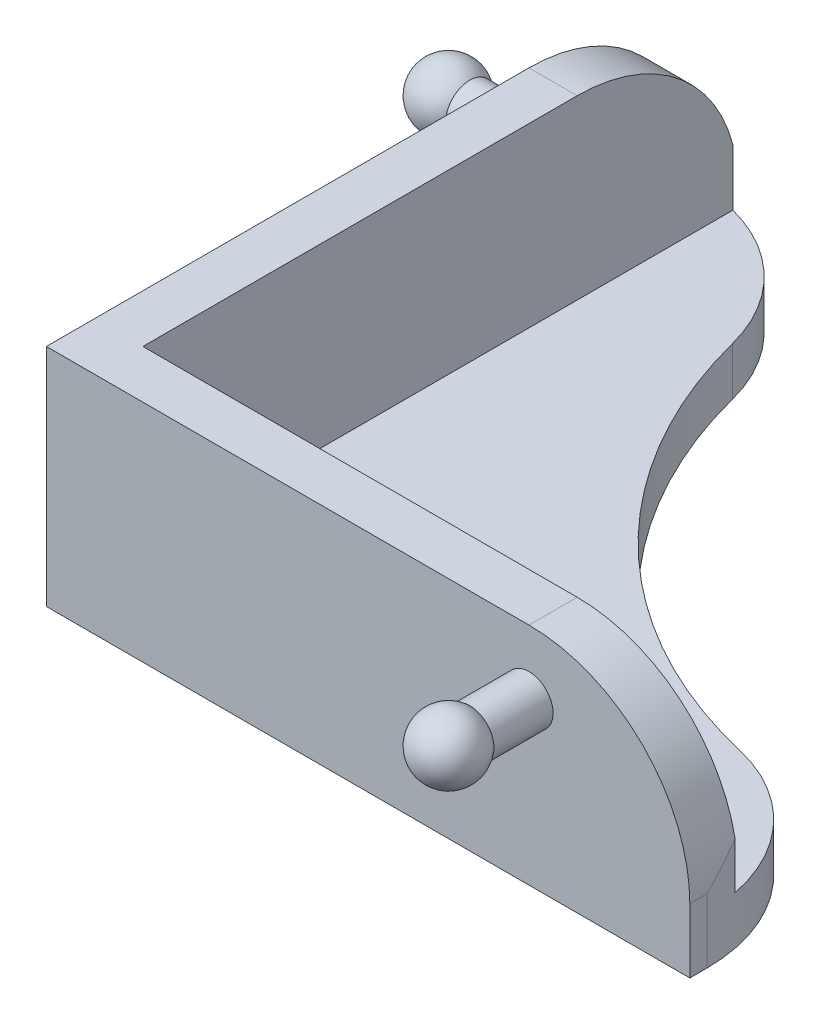
ISO-10303-21;
HEADER;
FILE_DESCRIPTION(('STEP AP214'),'2;1');
FILE_NAME('part.step','',(''),(''),'','','');
FILE_SCHEMA(('AUTOMOTIVE_DESIGN { 1 0 10303 214 1 1 1 1 }'));
ENDSEC;
DATA;
#1=APPLICATION_CONTEXT('core data for automotive mechanical design processes');
#2=APPLICATION_PROTOCOL_DEFINITION('international standard','automotive_design',2000,#1);
#3=PRODUCT_CONTEXT('',#1,'mechanical');
#4=PRODUCT('Part','Part','',(#3));
#5=PRODUCT_RELATED_PRODUCT_CATEGORY('part','',(#4));
#6=PRODUCT_DEFINITION_FORMATION('','',#4);
#7=PRODUCT_DEFINITION_CONTEXT('part definition',#1,'design');
#8=PRODUCT_DEFINITION('design','',#6,#7);
#9=PRODUCT_DEFINITION_SHAPE('','',#8);
#10=(LENGTH_UNIT() NAMED_UNIT(*) SI_UNIT(.MILLI.,.METRE.));
#11=(NAMED_UNIT(*) PLANE_ANGLE_UNIT() SI_UNIT($,.RADIAN.));
#12=(NAMED_UNIT(*) SI_UNIT($,.STERADIAN.) SOLID_ANGLE_UNIT());
#13=UNCERTAINTY_MEASURE_WITH_UNIT(LENGTH_MEASURE(1.E-05),#10,'distance_accuracy_value','');
#14=(GEOMETRIC_REPRESENTATION_CONTEXT(3) GLOBAL_UNCERTAINTY_ASSIGNED_CONTEXT((#13)) GLOBAL_UNIT_ASSIGNED_CONTEXT((#10,
#11,#12)) REPRESENTATION_CONTEXT('',''));
#15=CARTESIAN_POINT('',(0.,0.,0.));
#16=DIRECTION('',(0.,0.,1.));
#17=DIRECTION('',(1.,0.,0.));
#18=AXIS2_PLACEMENT_3D('',#15,#16,#17);
#19=CARTESIAN_POINT('',(0.,3.,0.));
#20=DIRECTION('',(0.,1.,0.));
#21=DIRECTION('',(0.,0.,1.));
#22=AXIS2_PLACEMENT_3D('',#19,#20,#21);
#23=PLANE('',#22);
#24=CARTESIAN_POINT('',(-16.3316434168253,3.,-19.5022624434389));
#25=DIRECTION('',(0.,1.,0.));
#26=DIRECTION('',(0.,0.,1.));
#27=AXIS2_PLACEMENT_3D('',#24,#25,#26);
#28=CIRCLE('',#27,10.);
#29=CARTESIAN_POINT('',(-6.64918505130675,3.,-22.0022624434389));
#30=VERTEX_POINT('',#29);
#31=CARTESIAN_POINT('',(-13.8131021136712,3.,-29.1799145194492));
#32=VERTEX_POINT('',#31);
#33=EDGE_CURVE('E228',#30,#32,#28,.T.);
#34=ORIENTED_EDGE('',*,*,#33,.T.);
#35=DIRECTION('',(0.,0.,1.));
#36=VECTOR('',#35,1.);
#37=CARTESIAN_POINT('',(-13.8131021136712,3.,0.));
#38=LINE('',#37,#36);
#39=CARTESIAN_POINT('',(-13.8131021136712,3.,7.49773755656109));
#40=VERTEX_POINT('',#39);
#41=EDGE_CURVE('E284',#32,#40,#38,.T.);
#42=ORIENTED_EDGE('',*,*,#41,.T.);
#43=DIRECTION('',(-1.,0.,0.));
#44=VECTOR('',#43,1.);
#45=CARTESIAN_POINT('',(0.,3.,7.49773755656109));
#46=LINE('',#45,#44);
#47=CARTESIAN_POINT('',(22.9998765107708,3.,7.49773755656109));
#48=VERTEX_POINT('',#47);
#49=EDGE_CURVE('E279',#48,#40,#46,.T.);
#50=ORIENTED_EDGE('',*,*,#49,.F.);
#51=CARTESIAN_POINT('',(13.1868978863288,3.,9.42269223557153));
#52=DIRECTION('',(0.,1.,0.));
#53=DIRECTION('',(0.,0.,1.));
#54=AXIS2_PLACEMENT_3D('',#51,#52,#53);
#55=CIRCLE('',#54,10.);
#56=CARTESIAN_POINT('',(15.4897209260588,3.,-0.30854643418108));
#57=VERTEX_POINT('',#56);
#58=EDGE_CURVE('E226',#57,#48,#55,.F.);
#59=ORIENTED_EDGE('',*,*,#58,.F.);
#60=CARTESIAN_POINT('',(22.3981900452489,3.,-29.5022624434389));
#61=DIRECTION('',(0.,1.,0.));
#62=DIRECTION('',(0.,0.,1.));
#63=AXIS2_PLACEMENT_3D('',#60,#61,#62);
#64=CIRCLE('',#63,30.);
#65=EDGE_CURVE('E232',#30,#57,#64,.T.);
#66=ORIENTED_EDGE('',*,*,#65,.F.);
#67=EDGE_LOOP('',(#34,#42,#50,#59,#66));
#68=FACE_BOUND('',#67,.T.);
#69=ADVANCED_FACE('F87',(#68),#23,.T.);
#70=CARTESIAN_POINT('',(22.3981900452489,3.,-29.5022624434389));
#71=DIRECTION('',(0.,-1.,0.));
#72=DIRECTION('',(0.,0.,-1.));
#73=AXIS2_PLACEMENT_3D('',#70,#71,#72);
#74=CYLINDRICAL_SURFACE('',#73,30.);
#75=CARTESIAN_POINT('',(22.3981900452489,0.,-29.5022624434389));
#76=DIRECTION('',(0.,1.,0.));
#77=DIRECTION('',(0.,0.,1.));
#78=AXIS2_PLACEMENT_3D('',#75,#76,#77);
#79=CIRCLE('',#78,30.);
#80=CARTESIAN_POINT('',(-6.64918505130675,0.,-22.0022624434389));
#81=VERTEX_POINT('',#80);
#82=CARTESIAN_POINT('',(15.4897209260588,0.,-0.30854643418108));
#83=VERTEX_POINT('',#82);
#84=EDGE_CURVE('E233',#81,#83,#79,.T.);
#85=ORIENTED_EDGE('',*,*,#84,.F.);
#86=DIRECTION('',(0.,-1.,0.));
#87=VECTOR('',#86,1.);
#88=CARTESIAN_POINT('',(-6.64918505130675,3.,-22.0022624434389));
#89=LINE('',#88,#87);
#90=EDGE_CURVE('E239',#30,#81,#89,.T.);
#91=ORIENTED_EDGE('',*,*,#90,.F.);
#92=ORIENTED_EDGE('',*,*,#65,.T.);
#93=DIRECTION('',(0.,-1.,0.));
#94=VECTOR('',#93,1.);
#95=CARTESIAN_POINT('',(15.4897209260588,3.,-0.30854643418108));
#96=LINE('',#95,#94);
#97=EDGE_CURVE('E264',#57,#83,#96,.T.);
#98=ORIENTED_EDGE('',*,*,#97,.T.);
#99=EDGE_LOOP('',(#85,#91,#92,#98));
#100=FACE_BOUND('',#99,.T.);
#101=ADVANCED_FACE('F331',(#100),#74,.F.);
#102=CARTESIAN_POINT('',(0.,0.,0.));
#103=DIRECTION('',(0.,1.,0.));
#104=DIRECTION('',(0.,0.,1.));
#105=AXIS2_PLACEMENT_3D('',#102,#103,#104);
#106=PLANE('',#105);
#107=DIRECTION('',(1.,0.,0.));
#108=VECTOR('',#107,1.);
#109=CARTESIAN_POINT('',(0.,0.,-29.5022624434389));
#110=LINE('',#109,#108);
#111=CARTESIAN_POINT('',(-16.8131021136712,0.,-29.5022624434389));
#112=VERTEX_POINT('',#111);
#113=CARTESIAN_POINT('',(-16.3316434168253,0.,-29.5022624434389));
#114=VERTEX_POINT('',#113);
#115=EDGE_CURVE('E242',#112,#114,#110,.T.);
#116=ORIENTED_EDGE('',*,*,#115,.T.);
#117=CARTESIAN_POINT('',(-16.3316434168253,0.,-19.5022624434389));
#118=DIRECTION('',(0.,1.,0.));
#119=DIRECTION('',(0.,0.,1.));
#120=AXIS2_PLACEMENT_3D('',#117,#118,#119);
#121=CIRCLE('',#120,10.);
#122=EDGE_CURVE('E223',#81,#114,#121,.T.);
#123=ORIENTED_EDGE('',*,*,#122,.F.);
#124=ORIENTED_EDGE('',*,*,#84,.T.);
#125=CARTESIAN_POINT('',(13.1868978863288,0.,9.42269223557153));
#126=DIRECTION('',(0.,1.,0.));
#127=DIRECTION('',(0.,0.,1.));
#128=AXIS2_PLACEMENT_3D('',#125,#126,#127);
#129=CIRCLE('',#128,10.);
#130=CARTESIAN_POINT('',(23.1868978863288,0.,9.42269223557153));
#131=VERTEX_POINT('',#130);
#132=EDGE_CURVE('E258',#83,#131,#129,.F.);
#133=ORIENTED_EDGE('',*,*,#132,.T.);
#134=DIRECTION('',(0.,0.,1.));
#135=VECTOR('',#134,1.);
#136=CARTESIAN_POINT('',(23.1868978863287,0.,0.));
#137=LINE('',#136,#135);
#138=CARTESIAN_POINT('',(23.1868978863288,0.,10.4977375565611));
#139=VERTEX_POINT('',#138);
#140=EDGE_CURVE('E252',#131,#139,#137,.T.);
#141=ORIENTED_EDGE('',*,*,#140,.T.);
#142=DIRECTION('',(1.,0.,0.));
#143=VECTOR('',#142,1.);
#144=CARTESIAN_POINT('',(0.,0.,10.4977375565611));
#145=LINE('',#144,#143);
#146=CARTESIAN_POINT('',(-16.8131021136712,0.,10.4977375565611));
#147=VERTEX_POINT('',#146);
#148=EDGE_CURVE('E249',#147,#139,#145,.T.);
#149=ORIENTED_EDGE('',*,*,#148,.F.);
#150=DIRECTION('',(0.,0.,1.));
#151=VECTOR('',#150,1.);
#152=CARTESIAN_POINT('',(-16.8131021136712,0.,0.));
#153=LINE('',#152,#151);
#154=EDGE_CURVE('E196',#112,#147,#153,.T.);
#155=ORIENTED_EDGE('',*,*,#154,.F.);
#156=EDGE_LOOP('',(#116,#123,#124,#133,#141,#149,#155));
#157=FACE_BOUND('',#156,.T.);
#158=ADVANCED_FACE('F339',(#157),#106,.F.);
#159=CARTESIAN_POINT('',(13.1868978863288,3.,9.42269223557153));
#160=DIRECTION('',(0.,-1.,0.));
#161=DIRECTION('',(0.,0.,-1.));
#162=AXIS2_PLACEMENT_3D('',#159,#160,#161);
#163=CYLINDRICAL_SURFACE('',#162,10.);
#164=DIRECTION('',(0.,-1.,0.));
#165=VECTOR('',#164,1.);
#166=CARTESIAN_POINT('',(22.9998765107708,14.,7.49773755656109));
#167=LINE('',#166,#165);
#168=CARTESIAN_POINT('',(22.9998765107708,5.92495467901039,7.49773755656109));
#169=VERTEX_POINT('',#168);
#170=EDGE_CURVE('E218',#169,#48,#167,.T.);
#171=ORIENTED_EDGE('',*,*,#170,.F.);
#172=CARTESIAN_POINT('',(13.1868978863288,4.,9.42269223557153));
#173=DIRECTION('',(0.,-0.707106781186547,-0.707106781186547));
#174=DIRECTION('',(0.,-0.707106781186547,0.707106781186547));
#175=AXIS2_PLACEMENT_3D('',#172,#173,#174);
#176=ELLIPSE('',#175,14.142135623731,10.);
#177=CARTESIAN_POINT('',(23.1868978863288,4.,9.42269223557153));
#178=VERTEX_POINT('',#177);
#179=EDGE_CURVE('E309',#169,#178,#176,.T.);
#180=ORIENTED_EDGE('',*,*,#179,.T.);
#181=DIRECTION('',(0.,-1.,0.));
#182=VECTOR('',#181,1.);
#183=CARTESIAN_POINT('',(23.1868978863288,3.,9.42269223557153));
#184=LINE('',#183,#182);
#185=EDGE_CURVE('E268',#178,#131,#184,.T.);
#186=ORIENTED_EDGE('',*,*,#185,.T.);
#187=ORIENTED_EDGE('',*,*,#132,.F.);
#188=ORIENTED_EDGE('',*,*,#97,.F.);
#189=ORIENTED_EDGE('',*,*,#58,.T.);
#190=EDGE_LOOP('',(#171,#180,#186,#187,#188,#189));
#191=FACE_BOUND('',#190,.T.);
#192=ADVANCED_FACE('F344',(#191),#163,.T.);
#193=CARTESIAN_POINT('',(23.1868978863287,3.,0.));
#194=DIRECTION('',(1.,0.,0.));
#195=DIRECTION('',(0.,0.,-1.));
#196=AXIS2_PLACEMENT_3D('',#193,#194,#195);
#197=PLANE('',#196);
#198=ORIENTED_EDGE('',*,*,#185,.F.);
#199=DIRECTION('',(0.,0.,1.));
#200=VECTOR('',#199,1.);
#201=CARTESIAN_POINT('',(23.1868978863287,4.,0.));
#202=LINE('',#201,#200);
#203=CARTESIAN_POINT('',(23.1868978863288,4.,10.4977375565611));
#204=VERTEX_POINT('',#203);
#205=EDGE_CURVE('E301',#178,#204,#202,.T.);
#206=ORIENTED_EDGE('',*,*,#205,.T.);
#207=DIRECTION('',(0.,-1.,0.));
#208=VECTOR('',#207,1.);
#209=CARTESIAN_POINT('',(23.1868978863288,3.,10.4977375565611));
#210=LINE('',#209,#208);
#211=EDGE_CURVE('E204',#204,#139,#210,.T.);
#212=ORIENTED_EDGE('',*,*,#211,.T.);
#213=ORIENTED_EDGE('',*,*,#140,.F.);
#214=EDGE_LOOP('',(#198,#206,#212,#213));
#215=FACE_BOUND('',#214,.T.);
#216=ADVANCED_FACE('F353',(#215),#197,.T.);
#217=CARTESIAN_POINT('',(0.,3.,10.4977375565611));
#218=DIRECTION('',(0.,0.,-1.));
#219=DIRECTION('',(-1.,0.,0.));
#220=AXIS2_PLACEMENT_3D('',#217,#218,#219);
#221=PLANE('',#220);
#222=CARTESIAN_POINT('',(13.1868978863288,10.,10.4977375565611));
#223=DIRECTION('',(0.,0.,1.));
#224=DIRECTION('',(1.,0.,0.));
#225=AXIS2_PLACEMENT_3D('',#222,#223,#224);
#226=CIRCLE('',#225,1.5);
#227=CARTESIAN_POINT('',(14.6868978863288,10.,10.4977375565611));
#228=VERTEX_POINT('',#227);
#229=EDGE_CURVE('E12',#228,#228,#226,.T.);
#230=ORIENTED_EDGE('',*,*,#229,.F.);
#231=EDGE_LOOP('',(#230));
#232=FACE_BOUND('',#231,.T.);
#233=ORIENTED_EDGE('',*,*,#211,.F.);
#234=CARTESIAN_POINT('',(13.1868978863288,4.,10.4977375565611));
#235=DIRECTION('',(0.,0.,-1.));
#236=DIRECTION('',(-1.,0.,0.));
#237=AXIS2_PLACEMENT_3D('',#234,#235,#236);
#238=CIRCLE('',#237,10.);
#239=CARTESIAN_POINT('',(13.1868978863288,14.,10.4977375565611));
#240=VERTEX_POINT('',#239);
#241=EDGE_CURVE('E114',#204,#240,#238,.F.);
#242=ORIENTED_EDGE('',*,*,#241,.T.);
#243=DIRECTION('',(1.,0.,0.));
#244=VECTOR('',#243,1.);
#245=CARTESIAN_POINT('',(0.,14.,10.4977375565611));
#246=LINE('',#245,#244);
#247=CARTESIAN_POINT('',(-16.8131021136712,14.,10.4977375565611));
#248=VERTEX_POINT('',#247);
#249=EDGE_CURVE('E188',#248,#240,#246,.T.);
#250=ORIENTED_EDGE('',*,*,#249,.F.);
#251=DIRECTION('',(0.,-1.,0.));
#252=VECTOR('',#251,1.);
#253=CARTESIAN_POINT('',(-16.8131021136712,3.,10.4977375565611));
#254=LINE('',#253,#252);
#255=EDGE_CURVE('E192',#248,#147,#254,.T.);
#256=ORIENTED_EDGE('',*,*,#255,.T.);
#257=ORIENTED_EDGE('',*,*,#148,.T.);
#258=EDGE_LOOP('',(#233,#242,#250,#256,#257));
#259=FACE_BOUND('',#258,.T.);
#260=ADVANCED_FACE('F210',(#232,#259),#221,.F.);
#261=CARTESIAN_POINT('',(-16.8131021136712,3.,0.));
#262=DIRECTION('',(1.,0.,0.));
#263=DIRECTION('',(0.,0.,-1.));
#264=AXIS2_PLACEMENT_3D('',#261,#262,#263);
#265=PLANE('',#264);
#266=CARTESIAN_POINT('',(-16.8131021136712,10.,-19.5022624434389));
#267=DIRECTION('',(-1.,0.,0.));
#268=DIRECTION('',(0.,0.,1.));
#269=AXIS2_PLACEMENT_3D('',#266,#267,#268);
#270=CIRCLE('',#269,1.5);
#271=CARTESIAN_POINT('',(-16.8131021136712,10.,-18.0022624434389));
#272=VERTEX_POINT('',#271);
#273=EDGE_CURVE('E100',#272,#272,#270,.T.);
#274=ORIENTED_EDGE('',*,*,#273,.F.);
#275=EDGE_LOOP('',(#274));
#276=FACE_BOUND('',#275,.T.);
#277=DIRECTION('',(0.,0.,1.));
#278=VECTOR('',#277,1.);
#279=CARTESIAN_POINT('',(-16.8131021136712,14.,0.));
#280=LINE('',#279,#278);
#281=CARTESIAN_POINT('',(-16.8131021136712,14.,-19.5022624434389));
#282=VERTEX_POINT('',#281);
#283=EDGE_CURVE('E182',#282,#248,#280,.T.);
#284=ORIENTED_EDGE('',*,*,#283,.F.);
#285=CARTESIAN_POINT('',(-16.8131021136712,4.,-19.5022624434389));
#286=DIRECTION('',(1.,0.,0.));
#287=DIRECTION('',(0.,0.,-1.));
#288=AXIS2_PLACEMENT_3D('',#285,#286,#287);
#289=CIRCLE('',#288,10.);
#290=CARTESIAN_POINT('',(-16.8131021136712,4.,-29.5022624434389));
#291=VERTEX_POINT('',#290);
#292=EDGE_CURVE('E296',#282,#291,#289,.F.);
#293=ORIENTED_EDGE('',*,*,#292,.T.);
#294=DIRECTION('',(0.,-1.,0.));
#295=VECTOR('',#294,1.);
#296=CARTESIAN_POINT('',(-16.8131021136712,3.,-29.5022624434389));
#297=LINE('',#296,#295);
#298=EDGE_CURVE('E201',#291,#112,#297,.T.);
#299=ORIENTED_EDGE('',*,*,#298,.T.);
#300=ORIENTED_EDGE('',*,*,#154,.T.);
#301=ORIENTED_EDGE('',*,*,#255,.F.);
#302=EDGE_LOOP('',(#284,#293,#299,#300,#301));
#303=FACE_BOUND('',#302,.T.);
#304=ADVANCED_FACE('F198',(#276,#303),#265,.F.);
#305=CARTESIAN_POINT('',(0.,3.,-29.5022624434389));
#306=DIRECTION('',(0.,0.,-1.));
#307=DIRECTION('',(-1.,0.,0.));
#308=AXIS2_PLACEMENT_3D('',#305,#306,#307);
#309=PLANE('',#308);
#310=ORIENTED_EDGE('',*,*,#298,.F.);
#311=DIRECTION('',(1.,0.,0.));
#312=VECTOR('',#311,1.);
#313=CARTESIAN_POINT('',(0.,4.,-29.5022624434389));
#314=LINE('',#313,#312);
#315=CARTESIAN_POINT('',(-16.3316434168253,4.,-29.5022624434389));
#316=VERTEX_POINT('',#315);
#317=EDGE_CURVE('E281',#291,#316,#314,.T.);
#318=ORIENTED_EDGE('',*,*,#317,.T.);
#319=DIRECTION('',(0.,-1.,0.));
#320=VECTOR('',#319,1.);
#321=CARTESIAN_POINT('',(-16.3316434168253,3.,-29.5022624434389));
#322=LINE('',#321,#320);
#323=EDGE_CURVE('E274',#316,#114,#322,.T.);
#324=ORIENTED_EDGE('',*,*,#323,.T.);
#325=ORIENTED_EDGE('',*,*,#115,.F.);
#326=EDGE_LOOP('',(#310,#318,#324,#325));
#327=FACE_BOUND('',#326,.T.);
#328=ADVANCED_FACE('F361',(#327),#309,.T.);
#329=CARTESIAN_POINT('',(-16.3316434168253,3.,-19.5022624434389));
#330=DIRECTION('',(0.,-1.,0.));
#331=DIRECTION('',(0.,0.,-1.));
#332=AXIS2_PLACEMENT_3D('',#329,#330,#331);
#333=CYLINDRICAL_SURFACE('',#332,10.);
#334=ORIENTED_EDGE('',*,*,#323,.F.);
#335=CARTESIAN_POINT('',(-16.3316434168253,4.,-19.5022624434389));
#336=DIRECTION('',(0.707106781186547,-0.707106781186547,0.));
#337=DIRECTION('',(0.707106781186547,0.707106781186547,0.));
#338=AXIS2_PLACEMENT_3D('',#335,#336,#337);
#339=ELLIPSE('',#338,14.142135623731,10.);
#340=CARTESIAN_POINT('',(-13.8131021136712,6.51854130315405,-29.1799145194492));
#341=VERTEX_POINT('',#340);
#342=EDGE_CURVE('E289',#316,#341,#339,.T.);
#343=ORIENTED_EDGE('',*,*,#342,.T.);
#344=DIRECTION('',(0.,-1.,0.));
#345=VECTOR('',#344,1.);
#346=CARTESIAN_POINT('',(-13.8131021136712,14.,-29.1799145194492));
#347=LINE('',#346,#345);
#348=EDGE_CURVE('E225',#341,#32,#347,.T.);
#349=ORIENTED_EDGE('',*,*,#348,.T.);
#350=ORIENTED_EDGE('',*,*,#33,.F.);
#351=ORIENTED_EDGE('',*,*,#90,.T.);
#352=ORIENTED_EDGE('',*,*,#122,.T.);
#353=EDGE_LOOP('',(#334,#343,#349,#350,#351,#352));
#354=FACE_BOUND('',#353,.T.);
#355=ADVANCED_FACE('F370',(#354),#333,.T.);
#356=CARTESIAN_POINT('',(-13.8131021136712,14.,0.));
#357=DIRECTION('',(-1.,0.,0.));
#358=DIRECTION('',(0.,0.,1.));
#359=AXIS2_PLACEMENT_3D('',#356,#357,#358);
#360=PLANE('',#359);
#361=ORIENTED_EDGE('',*,*,#348,.F.);
#362=CARTESIAN_POINT('',(-13.8131021136712,4.,-19.5022624434389));
#363=DIRECTION('',(-1.,0.,0.));
#364=DIRECTION('',(0.,0.,1.));
#365=AXIS2_PLACEMENT_3D('',#362,#363,#364);
#366=CIRCLE('',#365,10.);
#367=CARTESIAN_POINT('',(-13.8131021136712,14.,-19.5022624434389));
#368=VERTEX_POINT('',#367);
#369=EDGE_CURVE('E295',#341,#368,#366,.F.);
#370=ORIENTED_EDGE('',*,*,#369,.T.);
#371=DIRECTION('',(0.,0.,-1.));
#372=VECTOR('',#371,1.);
#373=CARTESIAN_POINT('',(-13.8131021136712,14.,0.));
#374=LINE('',#373,#372);
#375=CARTESIAN_POINT('',(-13.8131021136712,14.,7.49773755656109));
#376=VERTEX_POINT('',#375);
#377=EDGE_CURVE('E195',#376,#368,#374,.T.);
#378=ORIENTED_EDGE('',*,*,#377,.F.);
#379=DIRECTION('',(0.,-1.,0.));
#380=VECTOR('',#379,1.);
#381=CARTESIAN_POINT('',(-13.8131021136712,14.,7.49773755656109));
#382=LINE('',#381,#380);
#383=EDGE_CURVE('E215',#376,#40,#382,.T.);
#384=ORIENTED_EDGE('',*,*,#383,.T.);
#385=ORIENTED_EDGE('',*,*,#41,.F.);
#386=EDGE_LOOP('',(#361,#370,#378,#384,#385));
#387=FACE_BOUND('',#386,.T.);
#388=ADVANCED_FACE('F367',(#387),#360,.F.);
#389=CARTESIAN_POINT('',(0.,14.,7.49773755656109));
#390=DIRECTION('',(0.,0.,-1.));
#391=DIRECTION('',(-1.,0.,0.));
#392=AXIS2_PLACEMENT_3D('',#389,#390,#391);
#393=PLANE('',#392);
#394=DIRECTION('',(1.,0.,0.));
#395=VECTOR('',#394,1.);
#396=CARTESIAN_POINT('',(0.,14.,7.49773755656109));
#397=LINE('',#396,#395);
#398=CARTESIAN_POINT('',(13.1868978863288,14.,7.49773755656109));
#399=VERTEX_POINT('',#398);
#400=EDGE_CURVE('E207',#376,#399,#397,.T.);
#401=ORIENTED_EDGE('',*,*,#400,.T.);
#402=CARTESIAN_POINT('',(13.1868978863288,4.,7.49773755656109));
#403=DIRECTION('',(0.,0.,-1.));
#404=DIRECTION('',(-1.,0.,0.));
#405=AXIS2_PLACEMENT_3D('',#402,#403,#404);
#406=CIRCLE('',#405,10.);
#407=EDGE_CURVE('E104',#399,#169,#406,.T.);
#408=ORIENTED_EDGE('',*,*,#407,.T.);
#409=ORIENTED_EDGE('',*,*,#170,.T.);
#410=ORIENTED_EDGE('',*,*,#49,.T.);
#411=ORIENTED_EDGE('',*,*,#383,.F.);
#412=EDGE_LOOP('',(#401,#408,#409,#410,#411));
#413=FACE_BOUND('',#412,.T.);
#414=ADVANCED_FACE('F379',(#413),#393,.T.);
#415=CARTESIAN_POINT('',(0.,14.,0.));
#416=DIRECTION('',(0.,1.,0.));
#417=DIRECTION('',(0.,0.,1.));
#418=AXIS2_PLACEMENT_3D('',#415,#416,#417);
#419=PLANE('',#418);
#420=ORIENTED_EDGE('',*,*,#377,.T.);
#421=DIRECTION('',(1.,0.,0.));
#422=VECTOR('',#421,1.);
#423=CARTESIAN_POINT('',(0.,14.,-19.5022624434389));
#424=LINE('',#423,#422);
#425=EDGE_CURVE('E187',#368,#282,#424,.F.);
#426=ORIENTED_EDGE('',*,*,#425,.T.);
#427=ORIENTED_EDGE('',*,*,#283,.T.);
#428=ORIENTED_EDGE('',*,*,#249,.T.);
#429=DIRECTION('',(0.,0.,1.));
#430=VECTOR('',#429,1.);
#431=CARTESIAN_POINT('',(13.1868978863287,14.,0.));
#432=LINE('',#431,#430);
#433=EDGE_CURVE('E293',#240,#399,#432,.F.);
#434=ORIENTED_EDGE('',*,*,#433,.T.);
#435=ORIENTED_EDGE('',*,*,#400,.F.);
#436=EDGE_LOOP('',(#420,#426,#427,#428,#434,#435));
#437=FACE_BOUND('',#436,.T.);
#438=ADVANCED_FACE('F184',(#437),#419,.T.);
#439=CARTESIAN_POINT('',(0.,4.,-19.5022624434389));
#440=DIRECTION('',(1.,0.,0.));
#441=DIRECTION('',(0.,0.,-1.));
#442=AXIS2_PLACEMENT_3D('',#439,#440,#441);
#443=CYLINDRICAL_SURFACE('',#442,10.);
#444=ORIENTED_EDGE('',*,*,#292,.F.);
#445=ORIENTED_EDGE('',*,*,#425,.F.);
#446=ORIENTED_EDGE('',*,*,#369,.F.);
#447=ORIENTED_EDGE('',*,*,#342,.F.);
#448=ORIENTED_EDGE('',*,*,#317,.F.);
#449=EDGE_LOOP('',(#444,#445,#446,#447,#448));
#450=FACE_BOUND('',#449,.T.);
#451=ADVANCED_FACE('F375',(#450),#443,.T.);
#452=CARTESIAN_POINT('',(13.1868978863287,4.,0.));
#453=DIRECTION('',(0.,0.,1.));
#454=DIRECTION('',(1.,0.,0.));
#455=AXIS2_PLACEMENT_3D('',#452,#453,#454);
#456=CYLINDRICAL_SURFACE('',#455,10.);
#457=ORIENTED_EDGE('',*,*,#407,.F.);
#458=ORIENTED_EDGE('',*,*,#433,.F.);
#459=ORIENTED_EDGE('',*,*,#241,.F.);
#460=ORIENTED_EDGE('',*,*,#205,.F.);
#461=ORIENTED_EDGE('',*,*,#179,.F.);
#462=EDGE_LOOP('',(#457,#458,#459,#460,#461));
#463=FACE_BOUND('',#462,.T.);
#464=ADVANCED_FACE('F90',(#463),#456,.T.);
#465=CARTESIAN_POINT('',(-21.8131021136712,10.,-19.5022624434389));
#466=DIRECTION('',(1.,0.,0.));
#467=DIRECTION('',(0.,0.,-1.));
#468=AXIS2_PLACEMENT_3D('',#465,#466,#467);
#469=CYLINDRICAL_SURFACE('',#468,1.5);
#470=CARTESIAN_POINT('',(-20.4902264581389,10.,-19.5022624434389));
#471=DIRECTION('',(-0.999999999999999,0.,0.));
#472=DIRECTION('',(0.,0.,1.));
#473=AXIS2_PLACEMENT_3D('',#470,#471,#472);
#474=CIRCLE('',#473,1.5);
#475=CARTESIAN_POINT('',(-20.4902264581389,10.,-18.0022624434389));
#476=VERTEX_POINT('',#475);
#477=EDGE_CURVE('E315',#476,#476,#474,.F.);
#478=ORIENTED_EDGE('',*,*,#477,.T.);
#479=EDGE_LOOP('',(#478));
#480=FACE_BOUND('',#479,.T.);
#481=ORIENTED_EDGE('',*,*,#273,.T.);
#482=EDGE_LOOP('',(#481));
#483=FACE_BOUND('',#482,.T.);
#484=ADVANCED_FACE('F377',(#480,#483),#469,.T.);
#485=CARTESIAN_POINT('',(-21.8131021136712,10.,-19.5022624434389));
#486=DIRECTION('',(0.,1.,0.));
#487=DIRECTION('',(0.,0.,1.));
#488=AXIS2_PLACEMENT_3D('',#485,#486,#487);
#489=SPHERICAL_SURFACE('',#488,2.);
#490=CARTESIAN_POINT('',(-21.8131021136712,10.,-19.5022624434389));
#491=DIRECTION('',(-1.,0.,0.));
#492=DIRECTION('',(0.,0.,1.));
#493=AXIS2_PLACEMENT_3D('',#490,#491,#492);
#494=SPHERICAL_SURFACE('',#493,2.);
#495=ORIENTED_EDGE('',*,*,#477,.F.);
#496=EDGE_LOOP('',(#495));
#497=FACE_BOUND('',#496,.T.);
#498=ADVANCED_FACE('F332',(#497),#494,.T.);
#499=CARTESIAN_POINT('',(13.1868978863288,10.,15.4977375565611));
#500=DIRECTION('',(0.,0.,-1.));
#501=DIRECTION('',(-1.,0.,0.));
#502=AXIS2_PLACEMENT_3D('',#499,#500,#501);
#503=CYLINDRICAL_SURFACE('',#502,1.5);
#504=CARTESIAN_POINT('',(13.1868978863288,10.,14.1748619010288));
#505=DIRECTION('',(0.,0.,1.));
#506=DIRECTION('',(1.,0.,0.));
#507=AXIS2_PLACEMENT_3D('',#504,#505,#506);
#508=CIRCLE('',#507,1.5);
#509=CARTESIAN_POINT('',(14.6868978863288,10.,14.1748619010288));
#510=VERTEX_POINT('',#509);
#511=EDGE_CURVE('E93',#510,#510,#508,.F.);
#512=ORIENTED_EDGE('',*,*,#511,.T.);
#513=EDGE_LOOP('',(#512));
#514=FACE_BOUND('',#513,.T.);
#515=ORIENTED_EDGE('',*,*,#229,.T.);
#516=EDGE_LOOP('',(#515));
#517=FACE_BOUND('',#516,.T.);
#518=ADVANCED_FACE('F325',(#514,#517),#503,.T.);
#519=CARTESIAN_POINT('',(13.1868978863288,10.,15.4977375565611));
#520=DIRECTION('',(0.,1.,0.));
#521=DIRECTION('',(1.,0.,0.));
#522=AXIS2_PLACEMENT_3D('',#519,#520,#521);
#523=SPHERICAL_SURFACE('',#522,2.);
#524=CARTESIAN_POINT('',(13.1868978863288,10.,15.4977375565611));
#525=DIRECTION('',(0.,0.,1.));
#526=DIRECTION('',(1.,0.,0.));
#527=AXIS2_PLACEMENT_3D('',#524,#525,#526);
#528=SPHERICAL_SURFACE('',#527,2.);
#529=ORIENTED_EDGE('',*,*,#511,.F.);
#530=EDGE_LOOP('',(#529));
#531=FACE_BOUND('',#530,.T.);
#532=ADVANCED_FACE('F324',(#531),#528,.T.);
#533=CLOSED_SHELL('',(#69,#101,#158,#192,#216,#260,#304,#328,#355,#388,#414,#438,#451,#464,#484,
#498,#518,#532));
#534=MANIFOLD_SOLID_BREP('B2',#533);
#535=ADVANCED_BREP_SHAPE_REPRESENTATION('',(#18,#534),#14);
#536=SHAPE_DEFINITION_REPRESENTATION(#9,#535);
ENDSEC;
END-ISO-10303-21;
